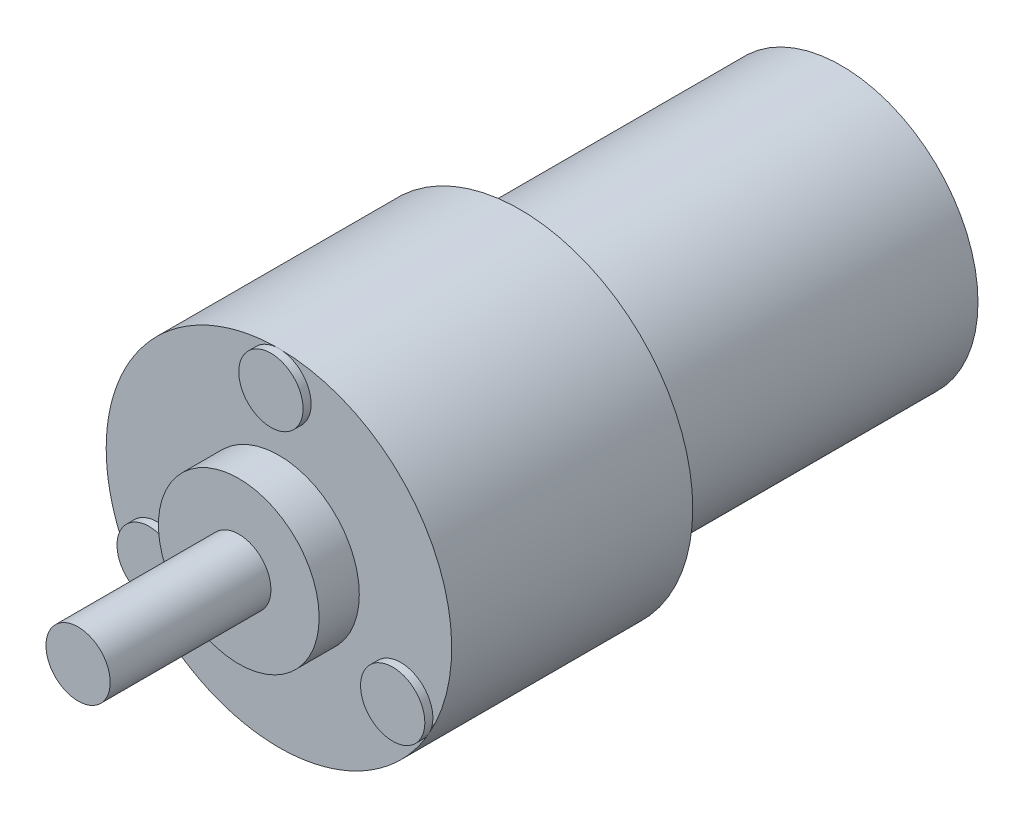
ISO-10303-21;
HEADER;
FILE_DESCRIPTION(('STEP AP214'),'2;1');
FILE_NAME('part.step','',(''),(''),'','','');
FILE_SCHEMA(('AUTOMOTIVE_DESIGN { 1 0 10303 214 1 1 1 1 }'));
ENDSEC;
DATA;
#1=APPLICATION_CONTEXT('core data for automotive mechanical design processes');
#2=APPLICATION_PROTOCOL_DEFINITION('international standard','automotive_design',2000,#1);
#3=PRODUCT_CONTEXT('',#1,'mechanical');
#4=PRODUCT('Part','Part','',(#3));
#5=PRODUCT_RELATED_PRODUCT_CATEGORY('part','',(#4));
#6=PRODUCT_DEFINITION_FORMATION('','',#4);
#7=PRODUCT_DEFINITION_CONTEXT('part definition',#1,'design');
#8=PRODUCT_DEFINITION('design','',#6,#7);
#9=PRODUCT_DEFINITION_SHAPE('','',#8);
#10=(LENGTH_UNIT() NAMED_UNIT(*) SI_UNIT(.MILLI.,.METRE.));
#11=(NAMED_UNIT(*) PLANE_ANGLE_UNIT() SI_UNIT($,.RADIAN.));
#12=(NAMED_UNIT(*) SI_UNIT($,.STERADIAN.) SOLID_ANGLE_UNIT());
#13=UNCERTAINTY_MEASURE_WITH_UNIT(LENGTH_MEASURE(1.E-05),#10,'distance_accuracy_value','');
#14=(GEOMETRIC_REPRESENTATION_CONTEXT(3) GLOBAL_UNCERTAINTY_ASSIGNED_CONTEXT((#13)) GLOBAL_UNIT_ASSIGNED_CONTEXT((#10,
#11,#12)) REPRESENTATION_CONTEXT('',''));
#15=CARTESIAN_POINT('',(0.,0.,0.));
#16=DIRECTION('',(0.,0.,1.));
#17=DIRECTION('',(1.,0.,0.));
#18=AXIS2_PLACEMENT_3D('',#15,#16,#17);
#19=CARTESIAN_POINT('',(0.,0.,30.));
#20=DIRECTION('',(0.,0.,1.));
#21=DIRECTION('',(1.,0.,0.));
#22=AXIS2_PLACEMENT_3D('',#19,#20,#21);
#23=PLANE('',#22);
#24=CARTESIAN_POINT('',(0.,0.,30.));
#25=DIRECTION('',(0.,0.,1.));
#26=DIRECTION('',(1.,0.,0.));
#27=AXIS2_PLACEMENT_3D('',#24,#25,#26);
#28=CIRCLE('',#27,10.);
#29=CARTESIAN_POINT('',(10.,0.,30.));
#30=VERTEX_POINT('',#29);
#31=EDGE_CURVE('E86',#30,#30,#28,.T.);
#32=ORIENTED_EDGE('',*,*,#31,.F.);
#33=EDGE_LOOP('',(#32));
#34=FACE_BOUND('',#33,.T.);
#35=CARTESIAN_POINT('',(0.,0.,30.));
#36=DIRECTION('',(0.,0.,1.));
#37=DIRECTION('',(1.,0.,0.));
#38=AXIS2_PLACEMENT_3D('',#35,#36,#37);
#39=CIRCLE('',#38,21.5);
#40=CARTESIAN_POINT('',(-18.6195461813655,-10.75,30.));
#41=VERTEX_POINT('',#40);
#42=CARTESIAN_POINT('',(18.6195461813655,-10.7499999999999,30.));
#43=VERTEX_POINT('',#42);
#44=EDGE_CURVE('E64',#41,#43,#39,.T.);
#45=ORIENTED_EDGE('',*,*,#44,.T.);
#46=CARTESIAN_POINT('',(15.1554445662277,-8.74999999999996,30.));
#47=DIRECTION('',(0.,0.,1.));
#48=DIRECTION('',(1.,0.,0.));
#49=AXIS2_PLACEMENT_3D('',#46,#47,#48);
#50=CIRCLE('',#49,4.);
#51=EDGE_CURVE('E45',#43,#43,#50,.T.);
#52=ORIENTED_EDGE('',*,*,#51,.F.);
#53=CARTESIAN_POINT('',(0.,21.5,30.));
#54=VERTEX_POINT('',#53);
#55=EDGE_CURVE('E56',#43,#54,#39,.T.);
#56=ORIENTED_EDGE('',*,*,#55,.T.);
#57=CARTESIAN_POINT('',(0.,17.5,30.));
#58=DIRECTION('',(0.,0.,1.));
#59=DIRECTION('',(1.,0.,0.));
#60=AXIS2_PLACEMENT_3D('',#57,#58,#59);
#61=CIRCLE('',#60,4.);
#62=EDGE_CURVE('E60',#54,#54,#61,.T.);
#63=ORIENTED_EDGE('',*,*,#62,.F.);
#64=EDGE_CURVE('E40',#54,#41,#39,.T.);
#65=ORIENTED_EDGE('',*,*,#64,.T.);
#66=CARTESIAN_POINT('',(-15.1554445662277,-8.74999999999996,30.));
#67=DIRECTION('',(0.,0.,1.));
#68=DIRECTION('',(1.,0.,0.));
#69=AXIS2_PLACEMENT_3D('',#66,#67,#68);
#70=CIRCLE('',#69,4.);
#71=EDGE_CURVE('E50',#41,#41,#70,.T.);
#72=ORIENTED_EDGE('',*,*,#71,.F.);
#73=EDGE_LOOP('',(#45,#52,#56,#63,#65,#72));
#74=FACE_BOUND('',#73,.T.);
#75=ADVANCED_FACE('F32',(#34,#74),#23,.T.);
#76=CARTESIAN_POINT('',(0.,0.,0.));
#77=DIRECTION('',(0.,0.,1.));
#78=DIRECTION('',(1.,0.,0.));
#79=AXIS2_PLACEMENT_3D('',#76,#77,#78);
#80=PLANE('',#79);
#81=CARTESIAN_POINT('',(0.,0.,0.));
#82=DIRECTION('',(0.,0.,1.));
#83=DIRECTION('',(1.,0.,0.));
#84=AXIS2_PLACEMENT_3D('',#81,#82,#83);
#85=CIRCLE('',#84,21.5);
#86=CARTESIAN_POINT('',(21.5,0.,0.));
#87=VERTEX_POINT('',#86);
#88=EDGE_CURVE('E65',#87,#87,#85,.T.);
#89=ORIENTED_EDGE('',*,*,#88,.F.);
#90=EDGE_LOOP('',(#89));
#91=FACE_BOUND('',#90,.T.);
#92=CARTESIAN_POINT('',(0.,0.,0.));
#93=DIRECTION('',(0.,0.,1.));
#94=DIRECTION('',(1.,0.,0.));
#95=AXIS2_PLACEMENT_3D('',#92,#93,#94);
#96=CIRCLE('',#95,17.);
#97=CARTESIAN_POINT('',(17.,0.,0.));
#98=VERTEX_POINT('',#97);
#99=EDGE_CURVE('E11',#98,#98,#96,.F.);
#100=ORIENTED_EDGE('',*,*,#99,.F.);
#101=EDGE_LOOP('',(#100));
#102=FACE_BOUND('',#101,.T.);
#103=ADVANCED_FACE('F99',(#91,#102),#80,.F.);
#104=CARTESIAN_POINT('',(0.,0.,35.));
#105=DIRECTION('',(0.,0.,1.));
#106=DIRECTION('',(1.,0.,0.));
#107=AXIS2_PLACEMENT_3D('',#104,#105,#106);
#108=PLANE('',#107);
#109=CARTESIAN_POINT('',(0.,0.,35.));
#110=DIRECTION('',(0.,0.,1.));
#111=DIRECTION('',(1.,0.,0.));
#112=AXIS2_PLACEMENT_3D('',#109,#110,#111);
#113=CIRCLE('',#112,10.);
#114=CARTESIAN_POINT('',(10.,0.,35.));
#115=VERTEX_POINT('',#114);
#116=EDGE_CURVE('E89',#115,#115,#113,.T.);
#117=ORIENTED_EDGE('',*,*,#116,.T.);
#118=EDGE_LOOP('',(#117));
#119=FACE_BOUND('',#118,.T.);
#120=CARTESIAN_POINT('',(0.,0.,35.));
#121=DIRECTION('',(0.,0.,1.));
#122=DIRECTION('',(1.,0.,0.));
#123=AXIS2_PLACEMENT_3D('',#120,#121,#122);
#124=CIRCLE('',#123,4.);
#125=CARTESIAN_POINT('',(4.,0.,35.));
#126=VERTEX_POINT('',#125);
#127=EDGE_CURVE('E80',#126,#126,#124,.T.);
#128=ORIENTED_EDGE('',*,*,#127,.F.);
#129=EDGE_LOOP('',(#128));
#130=FACE_BOUND('',#129,.T.);
#131=ADVANCED_FACE('F96',(#119,#130),#108,.T.);
#132=CARTESIAN_POINT('',(0.,0.,30.));
#133=DIRECTION('',(0.,0.,-1.));
#134=DIRECTION('',(-1.,0.,0.));
#135=AXIS2_PLACEMENT_3D('',#132,#133,#134);
#136=CYLINDRICAL_SURFACE('',#135,21.5);
#137=ORIENTED_EDGE('',*,*,#64,.F.);
#138=ORIENTED_EDGE('',*,*,#55,.F.);
#139=ORIENTED_EDGE('',*,*,#44,.F.);
#140=EDGE_LOOP('',(#137,#138,#139));
#141=FACE_BOUND('',#140,.T.);
#142=ORIENTED_EDGE('',*,*,#88,.T.);
#143=EDGE_LOOP('',(#142));
#144=FACE_BOUND('',#143,.T.);
#145=ADVANCED_FACE('F34',(#141,#144),#136,.T.);
#146=CARTESIAN_POINT('',(0.,0.,35.));
#147=DIRECTION('',(0.,0.,-1.));
#148=DIRECTION('',(-1.,0.,0.));
#149=AXIS2_PLACEMENT_3D('',#146,#147,#148);
#150=CYLINDRICAL_SURFACE('',#149,10.);
#151=ORIENTED_EDGE('',*,*,#116,.F.);
#152=EDGE_LOOP('',(#151));
#153=FACE_BOUND('',#152,.T.);
#154=ORIENTED_EDGE('',*,*,#31,.T.);
#155=EDGE_LOOP('',(#154));
#156=FACE_BOUND('',#155,.T.);
#157=ADVANCED_FACE('F95',(#153,#156),#150,.T.);
#158=CARTESIAN_POINT('',(0.,0.,55.));
#159=DIRECTION('',(0.,0.,-1.));
#160=DIRECTION('',(-1.,0.,0.));
#161=AXIS2_PLACEMENT_3D('',#158,#159,#160);
#162=CYLINDRICAL_SURFACE('',#161,4.);
#163=CARTESIAN_POINT('',(0.,0.,55.));
#164=DIRECTION('',(0.,0.,1.));
#165=DIRECTION('',(1.,0.,0.));
#166=AXIS2_PLACEMENT_3D('',#163,#164,#165);
#167=CIRCLE('',#166,4.);
#168=CARTESIAN_POINT('',(4.,0.,55.));
#169=VERTEX_POINT('',#168);
#170=EDGE_CURVE('E83',#169,#169,#167,.T.);
#171=ORIENTED_EDGE('',*,*,#170,.F.);
#172=EDGE_LOOP('',(#171));
#173=FACE_BOUND('',#172,.T.);
#174=ORIENTED_EDGE('',*,*,#127,.T.);
#175=EDGE_LOOP('',(#174));
#176=FACE_BOUND('',#175,.T.);
#177=ADVANCED_FACE('F117',(#173,#176),#162,.T.);
#178=CARTESIAN_POINT('',(0.,0.,55.));
#179=DIRECTION('',(0.,0.,1.));
#180=DIRECTION('',(1.,0.,0.));
#181=AXIS2_PLACEMENT_3D('',#178,#179,#180);
#182=PLANE('',#181);
#183=ORIENTED_EDGE('',*,*,#170,.T.);
#184=EDGE_LOOP('',(#183));
#185=FACE_BOUND('',#184,.T.);
#186=ADVANCED_FACE('F108',(#185),#182,.T.);
#187=CARTESIAN_POINT('',(0.,0.,-40.));
#188=DIRECTION('',(0.,0.,1.));
#189=DIRECTION('',(1.,0.,0.));
#190=AXIS2_PLACEMENT_3D('',#187,#188,#189);
#191=CYLINDRICAL_SURFACE('',#190,17.);
#192=CARTESIAN_POINT('',(0.,0.,-40.));
#193=DIRECTION('',(0.,0.,-1.));
#194=DIRECTION('',(-1.,0.,0.));
#195=AXIS2_PLACEMENT_3D('',#192,#193,#194);
#196=CIRCLE('',#195,17.);
#197=CARTESIAN_POINT('',(-17.,0.,-40.));
#198=VERTEX_POINT('',#197);
#199=EDGE_CURVE('E72',#198,#198,#196,.T.);
#200=ORIENTED_EDGE('',*,*,#199,.F.);
#201=EDGE_LOOP('',(#200));
#202=FACE_BOUND('',#201,.T.);
#203=ORIENTED_EDGE('',*,*,#99,.T.);
#204=EDGE_LOOP('',(#203));
#205=FACE_BOUND('',#204,.T.);
#206=ADVANCED_FACE('F105',(#202,#205),#191,.T.);
#207=CARTESIAN_POINT('',(0.,0.,-40.));
#208=DIRECTION('',(0.,0.,-1.));
#209=DIRECTION('',(-1.,0.,0.));
#210=AXIS2_PLACEMENT_3D('',#207,#208,#209);
#211=PLANE('',#210);
#212=ORIENTED_EDGE('',*,*,#199,.T.);
#213=EDGE_LOOP('',(#212));
#214=FACE_BOUND('',#213,.T.);
#215=ADVANCED_FACE('F107',(#214),#211,.T.);
#216=CARTESIAN_POINT('',(0.,17.5,31.));
#217=DIRECTION('',(0.,0.,-1.));
#218=DIRECTION('',(-1.,0.,0.));
#219=AXIS2_PLACEMENT_3D('',#216,#217,#218);
#220=CYLINDRICAL_SURFACE('',#219,4.);
#221=CARTESIAN_POINT('',(0.,17.5,31.));
#222=DIRECTION('',(0.,0.,1.));
#223=DIRECTION('',(1.,0.,0.));
#224=AXIS2_PLACEMENT_3D('',#221,#222,#223);
#225=CIRCLE('',#224,4.);
#226=CARTESIAN_POINT('',(4.,17.5,31.));
#227=VERTEX_POINT('',#226);
#228=EDGE_CURVE('E68',#227,#227,#225,.T.);
#229=ORIENTED_EDGE('',*,*,#228,.F.);
#230=EDGE_LOOP('',(#229));
#231=FACE_BOUND('',#230,.T.);
#232=ORIENTED_EDGE('',*,*,#62,.T.);
#233=EDGE_LOOP('',(#232));
#234=FACE_BOUND('',#233,.T.);
#235=ADVANCED_FACE('F67',(#231,#234),#220,.T.);
#236=CARTESIAN_POINT('',(0.,17.5,31.));
#237=DIRECTION('',(0.,0.,1.));
#238=DIRECTION('',(1.,0.,0.));
#239=AXIS2_PLACEMENT_3D('',#236,#237,#238);
#240=PLANE('',#239);
#241=ORIENTED_EDGE('',*,*,#228,.T.);
#242=EDGE_LOOP('',(#241));
#243=FACE_BOUND('',#242,.T.);
#244=ADVANCED_FACE('F184',(#243),#240,.T.);
#245=CARTESIAN_POINT('',(-15.1554445662277,-8.74999999999996,31.));
#246=DIRECTION('',(0.,0.,-1.));
#247=DIRECTION('',(-1.,0.,0.));
#248=AXIS2_PLACEMENT_3D('',#245,#246,#247);
#249=CYLINDRICAL_SURFACE('',#248,4.);
#250=CARTESIAN_POINT('',(-15.1554445662277,-8.74999999999996,31.));
#251=DIRECTION('',(0.,0.,1.));
#252=DIRECTION('',(1.,0.,0.));
#253=AXIS2_PLACEMENT_3D('',#250,#251,#252);
#254=CIRCLE('',#253,4.);
#255=CARTESIAN_POINT('',(-11.1554445662277,-8.74999999999996,31.));
#256=VERTEX_POINT('',#255);
#257=EDGE_CURVE('E69',#256,#256,#254,.T.);
#258=ORIENTED_EDGE('',*,*,#257,.F.);
#259=EDGE_LOOP('',(#258));
#260=FACE_BOUND('',#259,.T.);
#261=ORIENTED_EDGE('',*,*,#71,.T.);
#262=EDGE_LOOP('',(#261));
#263=FACE_BOUND('',#262,.T.);
#264=ADVANCED_FACE('F194',(#260,#263),#249,.T.);
#265=CARTESIAN_POINT('',(-15.1554445662277,-8.74999999999996,31.));
#266=DIRECTION('',(0.,0.,1.));
#267=DIRECTION('',(1.,0.,0.));
#268=AXIS2_PLACEMENT_3D('',#265,#266,#267);
#269=PLANE('',#268);
#270=ORIENTED_EDGE('',*,*,#257,.T.);
#271=EDGE_LOOP('',(#270));
#272=FACE_BOUND('',#271,.T.);
#273=ADVANCED_FACE('F204',(#272),#269,.T.);
#274=CARTESIAN_POINT('',(15.1554445662277,-8.74999999999996,31.));
#275=DIRECTION('',(0.,0.,-1.));
#276=DIRECTION('',(-1.,0.,0.));
#277=AXIS2_PLACEMENT_3D('',#274,#275,#276);
#278=CYLINDRICAL_SURFACE('',#277,4.);
#279=CARTESIAN_POINT('',(15.1554445662277,-8.74999999999996,31.));
#280=DIRECTION('',(0.,0.,1.));
#281=DIRECTION('',(1.,0.,0.));
#282=AXIS2_PLACEMENT_3D('',#279,#280,#281);
#283=CIRCLE('',#282,4.);
#284=CARTESIAN_POINT('',(19.1554445662277,-8.74999999999996,31.));
#285=VERTEX_POINT('',#284);
#286=EDGE_CURVE('E240',#285,#285,#283,.T.);
#287=ORIENTED_EDGE('',*,*,#286,.F.);
#288=EDGE_LOOP('',(#287));
#289=FACE_BOUND('',#288,.T.);
#290=ORIENTED_EDGE('',*,*,#51,.T.);
#291=EDGE_LOOP('',(#290));
#292=FACE_BOUND('',#291,.T.);
#293=ADVANCED_FACE('F214',(#289,#292),#278,.T.);
#294=CARTESIAN_POINT('',(15.1554445662277,-8.74999999999996,31.));
#295=DIRECTION('',(0.,0.,1.));
#296=DIRECTION('',(1.,0.,0.));
#297=AXIS2_PLACEMENT_3D('',#294,#295,#296);
#298=PLANE('',#297);
#299=ORIENTED_EDGE('',*,*,#286,.T.);
#300=EDGE_LOOP('',(#299));
#301=FACE_BOUND('',#300,.T.);
#302=ADVANCED_FACE('F224',(#301),#298,.T.);
#303=CLOSED_SHELL('',(#75,#103,#131,#145,#157,#177,#186,#206,#215,#235,#244,#264,#273,#293,#302));
#304=MANIFOLD_SOLID_BREP('B2',#303);
#305=ADVANCED_BREP_SHAPE_REPRESENTATION('',(#18,#304),#14);
#306=SHAPE_DEFINITION_REPRESENTATION(#9,#305);
ENDSEC;
END-ISO-10303-21;
